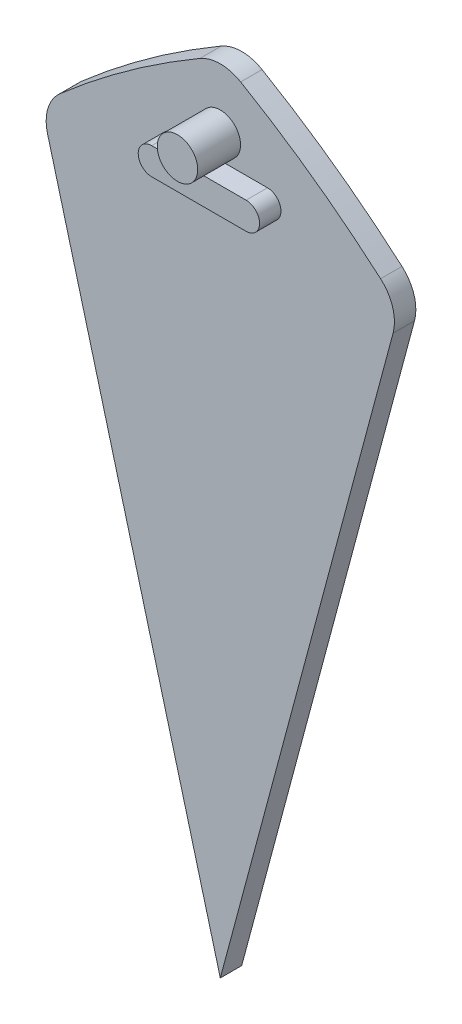
ISO-10303-21;
HEADER;
FILE_DESCRIPTION(('STEP AP214'),'2;1');
FILE_NAME('part.step','',(''),(''),'','','');
FILE_SCHEMA(('AUTOMOTIVE_DESIGN { 1 0 10303 214 1 1 1 1 }'));
ENDSEC;
DATA;
#1=APPLICATION_CONTEXT('core data for automotive mechanical design processes');
#2=APPLICATION_PROTOCOL_DEFINITION('international standard','automotive_design',2000,#1);
#3=PRODUCT_CONTEXT('',#1,'mechanical');
#4=PRODUCT('Part','Part','',(#3));
#5=PRODUCT_RELATED_PRODUCT_CATEGORY('part','',(#4));
#6=PRODUCT_DEFINITION_FORMATION('','',#4);
#7=PRODUCT_DEFINITION_CONTEXT('part definition',#1,'design');
#8=PRODUCT_DEFINITION('design','',#6,#7);
#9=PRODUCT_DEFINITION_SHAPE('','',#8);
#10=(LENGTH_UNIT() NAMED_UNIT(*) SI_UNIT(.MILLI.,.METRE.));
#11=(NAMED_UNIT(*) PLANE_ANGLE_UNIT() SI_UNIT($,.RADIAN.));
#12=(NAMED_UNIT(*) SI_UNIT($,.STERADIAN.) SOLID_ANGLE_UNIT());
#13=UNCERTAINTY_MEASURE_WITH_UNIT(LENGTH_MEASURE(1.E-05),#10,'distance_accuracy_value','');
#14=(GEOMETRIC_REPRESENTATION_CONTEXT(3) GLOBAL_UNCERTAINTY_ASSIGNED_CONTEXT((#13)) GLOBAL_UNIT_ASSIGNED_CONTEXT((#10,
#11,#12)) REPRESENTATION_CONTEXT('',''));
#15=CARTESIAN_POINT('',(0.,0.,0.));
#16=DIRECTION('',(0.,0.,1.));
#17=DIRECTION('',(1.,0.,0.));
#18=AXIS2_PLACEMENT_3D('',#15,#16,#17);
#19=CARTESIAN_POINT('',(0.,0.,3.175));
#20=DIRECTION('',(0.,0.,1.));
#21=DIRECTION('',(1.,0.,0.));
#22=AXIS2_PLACEMENT_3D('',#19,#20,#21);
#23=PLANE('',#22);
#24=CARTESIAN_POINT('',(0.,108.5,3.175));
#25=DIRECTION('',(0.,0.,1.));
#26=DIRECTION('',(1.,0.,0.));
#27=AXIS2_PLACEMENT_3D('',#24,#25,#26);
#28=CIRCLE('',#27,3.);
#29=CARTESIAN_POINT('',(3.,108.5,3.175));
#30=VERTEX_POINT('',#29);
#31=EDGE_CURVE('E276',#30,#30,#28,.T.);
#32=ORIENTED_EDGE('',*,*,#31,.F.);
#33=EDGE_LOOP('',(#32));
#34=FACE_BOUND('',#33,.T.);
#35=DIRECTION('',(0.258819045102521,0.965925826289068,0.));
#36=VECTOR('',#35,1.);
#37=CARTESIAN_POINT('',(0.,0.,3.175));
#38=LINE('',#37,#36);
#39=CARTESIAN_POINT('',(0.,0.,3.175));
#40=VERTEX_POINT('',#39);
#41=CARTESIAN_POINT('',(25.6246731471185,95.632582112392,3.175));
#42=VERTEX_POINT('',#41);
#43=EDGE_CURVE('E162',#40,#42,#38,.T.);
#44=ORIENTED_EDGE('',*,*,#43,.T.);
#45=CARTESIAN_POINT('',(19.8291181893841,97.1854963830071,3.175));
#46=DIRECTION('',(0.,0.,1.));
#47=DIRECTION('',(1.,0.,0.));
#48=AXIS2_PLACEMENT_3D('',#45,#46,#47);
#49=CIRCLE('',#48,6.);
#50=CARTESIAN_POINT('',(23.7746585702857,101.705752028728,3.175));
#51=VERTEX_POINT('',#50);
#52=EDGE_CURVE('E178',#42,#51,#49,.T.);
#53=ORIENTED_EDGE('',*,*,#52,.T.);
#54=CARTESIAN_POINT('',(-65.,0.,3.175));
#55=DIRECTION('',(0.,0.,1.));
#56=DIRECTION('',(1.,0.,0.));
#57=AXIS2_PLACEMENT_3D('',#54,#55,#56);
#58=CIRCLE('',#57,135.);
#59=CARTESIAN_POINT('',(3.02325581395349,116.609762320611,3.175));
#60=VERTEX_POINT('',#59);
#61=EDGE_CURVE('E146',#51,#60,#58,.T.);
#62=ORIENTED_EDGE('',*,*,#61,.T.);
#63=CARTESIAN_POINT('',(0.,111.427106217473,3.175));
#64=DIRECTION('',(0.,0.,1.));
#65=DIRECTION('',(1.,0.,0.));
#66=AXIS2_PLACEMENT_3D('',#63,#64,#65);
#67=CIRCLE('',#66,6.);
#68=CARTESIAN_POINT('',(-3.0232558139535,116.609762320611,3.175));
#69=VERTEX_POINT('',#68);
#70=EDGE_CURVE('E176',#60,#69,#67,.T.);
#71=ORIENTED_EDGE('',*,*,#70,.T.);
#72=CARTESIAN_POINT('',(65.,0.,3.175));
#73=DIRECTION('',(0.,0.,1.));
#74=DIRECTION('',(1.,0.,0.));
#75=AXIS2_PLACEMENT_3D('',#72,#73,#74);
#76=CIRCLE('',#75,135.);
#77=CARTESIAN_POINT('',(-23.7746585702858,101.705752028728,3.175));
#78=VERTEX_POINT('',#77);
#79=EDGE_CURVE('E143',#69,#78,#76,.T.);
#80=ORIENTED_EDGE('',*,*,#79,.T.);
#81=CARTESIAN_POINT('',(-19.8291181893842,97.1854963830071,3.175));
#82=DIRECTION('',(0.,0.,1.));
#83=DIRECTION('',(1.,0.,0.));
#84=AXIS2_PLACEMENT_3D('',#81,#82,#83);
#85=CIRCLE('',#84,6.);
#86=CARTESIAN_POINT('',(-25.6246731471186,95.632582112392,3.175));
#87=VERTEX_POINT('',#86);
#88=EDGE_CURVE('E174',#78,#87,#85,.T.);
#89=ORIENTED_EDGE('',*,*,#88,.T.);
#90=DIRECTION('',(-0.258819045102522,0.965925826289068,0.));
#91=VECTOR('',#90,1.);
#92=CARTESIAN_POINT('',(0.,0.,3.175));
#93=LINE('',#92,#91);
#94=EDGE_CURVE('E160',#40,#87,#93,.T.);
#95=ORIENTED_EDGE('',*,*,#94,.F.);
#96=EDGE_LOOP('',(#44,#53,#62,#71,#80,#89,#95));
#97=FACE_BOUND('',#96,.T.);
#98=DIRECTION('',(-1.,0.,0.));
#99=VECTOR('',#98,1.);
#100=CARTESIAN_POINT('',(7.,105.,3.175));
#101=LINE('',#100,#99);
#102=CARTESIAN_POINT('',(7.,105.,3.175));
#103=VERTEX_POINT('',#102);
#104=CARTESIAN_POINT('',(-7.,105.,3.175));
#105=VERTEX_POINT('',#104);
#106=EDGE_CURVE('E278',#103,#105,#101,.T.);
#107=ORIENTED_EDGE('',*,*,#106,.F.);
#108=CARTESIAN_POINT('',(7.,103.,3.175));
#109=DIRECTION('',(0.,0.,1.));
#110=DIRECTION('',(1.,0.,0.));
#111=AXIS2_PLACEMENT_3D('',#108,#109,#110);
#112=CIRCLE('',#111,2.);
#113=CARTESIAN_POINT('',(7.,101.,3.175));
#114=VERTEX_POINT('',#113);
#115=EDGE_CURVE('E141',#114,#103,#112,.T.);
#116=ORIENTED_EDGE('',*,*,#115,.F.);
#117=DIRECTION('',(1.,0.,0.));
#118=VECTOR('',#117,1.);
#119=CARTESIAN_POINT('',(7.,101.,3.175));
#120=LINE('',#119,#118);
#121=CARTESIAN_POINT('',(-7.,101.,3.175));
#122=VERTEX_POINT('',#121);
#123=EDGE_CURVE('E137',#122,#114,#120,.T.);
#124=ORIENTED_EDGE('',*,*,#123,.F.);
#125=CARTESIAN_POINT('',(-7.,103.,3.175));
#126=DIRECTION('',(0.,0.,1.));
#127=DIRECTION('',(1.,0.,0.));
#128=AXIS2_PLACEMENT_3D('',#125,#126,#127);
#129=CIRCLE('',#128,2.);
#130=EDGE_CURVE('E287',#105,#122,#129,.T.);
#131=ORIENTED_EDGE('',*,*,#130,.F.);
#132=EDGE_LOOP('',(#107,#116,#124,#131));
#133=FACE_BOUND('',#132,.T.);
#134=ADVANCED_FACE('F35',(#34,#97,#133),#23,.T.);
#135=CARTESIAN_POINT('',(0.,0.,3.175));
#136=DIRECTION('',(-0.965925826289068,-0.258819045102522,0.));
#137=DIRECTION('',(0.258819045102522,-0.965925826289068,0.));
#138=AXIS2_PLACEMENT_3D('',#135,#136,#137);
#139=PLANE('',#138);
#140=ORIENTED_EDGE('',*,*,#94,.T.);
#141=DIRECTION('',(0.,0.,1.));
#142=VECTOR('',#141,1.);
#143=CARTESIAN_POINT('',(-25.6246731471186,95.632582112392,3.175));
#144=LINE('',#143,#142);
#145=CARTESIAN_POINT('',(-25.6246731471186,95.632582112392,0.));
#146=VERTEX_POINT('',#145);
#147=EDGE_CURVE('E11',#87,#146,#144,.F.);
#148=ORIENTED_EDGE('',*,*,#147,.T.);
#149=DIRECTION('',(-0.258819045102522,0.965925826289068,0.));
#150=VECTOR('',#149,1.);
#151=CARTESIAN_POINT('',(0.,0.,0.));
#152=LINE('',#151,#150);
#153=CARTESIAN_POINT('',(0.,0.,0.));
#154=VERTEX_POINT('',#153);
#155=EDGE_CURVE('E156',#154,#146,#152,.T.);
#156=ORIENTED_EDGE('',*,*,#155,.F.);
#157=DIRECTION('',(0.,0.,-1.));
#158=VECTOR('',#157,1.);
#159=CARTESIAN_POINT('',(0.,0.,3.175));
#160=LINE('',#159,#158);
#161=EDGE_CURVE('E166',#40,#154,#160,.T.);
#162=ORIENTED_EDGE('',*,*,#161,.F.);
#163=EDGE_LOOP('',(#140,#148,#156,#162));
#164=FACE_BOUND('',#163,.T.);
#165=ADVANCED_FACE('F222',(#164),#139,.T.);
#166=CARTESIAN_POINT('',(0.,0.,3.175));
#167=DIRECTION('',(-0.965925826289068,0.258819045102521,0.));
#168=DIRECTION('',(-0.258819045102521,-0.965925826289068,0.));
#169=AXIS2_PLACEMENT_3D('',#166,#167,#168);
#170=PLANE('',#169);
#171=DIRECTION('',(0.258819045102521,0.965925826289068,0.));
#172=VECTOR('',#171,1.);
#173=CARTESIAN_POINT('',(0.,0.,0.));
#174=LINE('',#173,#172);
#175=CARTESIAN_POINT('',(25.6246731471185,95.632582112392,0.));
#176=VERTEX_POINT('',#175);
#177=EDGE_CURVE('E163',#154,#176,#174,.T.);
#178=ORIENTED_EDGE('',*,*,#177,.T.);
#179=DIRECTION('',(0.,0.,-1.));
#180=VECTOR('',#179,1.);
#181=CARTESIAN_POINT('',(25.6246731471185,95.632582112392,3.175));
#182=LINE('',#181,#180);
#183=EDGE_CURVE('E171',#176,#42,#182,.F.);
#184=ORIENTED_EDGE('',*,*,#183,.T.);
#185=ORIENTED_EDGE('',*,*,#43,.F.);
#186=ORIENTED_EDGE('',*,*,#161,.T.);
#187=EDGE_LOOP('',(#178,#184,#185,#186));
#188=FACE_BOUND('',#187,.T.);
#189=ADVANCED_FACE('F220',(#188),#170,.F.);
#190=CARTESIAN_POINT('',(0.,0.,0.));
#191=DIRECTION('',(0.,0.,1.));
#192=DIRECTION('',(1.,0.,0.));
#193=AXIS2_PLACEMENT_3D('',#190,#191,#192);
#194=PLANE('',#193);
#195=CARTESIAN_POINT('',(-65.,0.,0.));
#196=DIRECTION('',(0.,0.,1.));
#197=DIRECTION('',(1.,0.,0.));
#198=AXIS2_PLACEMENT_3D('',#195,#196,#197);
#199=CIRCLE('',#198,135.);
#200=CARTESIAN_POINT('',(23.7746585702857,101.705752028728,0.));
#201=VERTEX_POINT('',#200);
#202=CARTESIAN_POINT('',(3.02325581395349,116.609762320611,0.));
#203=VERTEX_POINT('',#202);
#204=EDGE_CURVE('E154',#201,#203,#199,.T.);
#205=ORIENTED_EDGE('',*,*,#204,.F.);
#206=CARTESIAN_POINT('',(19.8291181893841,97.1854963830071,0.));
#207=DIRECTION('',(0.,0.,1.));
#208=DIRECTION('',(1.,0.,0.));
#209=AXIS2_PLACEMENT_3D('',#206,#207,#208);
#210=CIRCLE('',#209,6.);
#211=EDGE_CURVE('E189',#201,#176,#210,.F.);
#212=ORIENTED_EDGE('',*,*,#211,.T.);
#213=ORIENTED_EDGE('',*,*,#177,.F.);
#214=ORIENTED_EDGE('',*,*,#155,.T.);
#215=CARTESIAN_POINT('',(-19.8291181893842,97.1854963830071,0.));
#216=DIRECTION('',(0.,0.,1.));
#217=DIRECTION('',(1.,0.,0.));
#218=AXIS2_PLACEMENT_3D('',#215,#216,#217);
#219=CIRCLE('',#218,6.);
#220=CARTESIAN_POINT('',(-23.7746585702858,101.705752028728,0.));
#221=VERTEX_POINT('',#220);
#222=EDGE_CURVE('E185',#146,#221,#219,.F.);
#223=ORIENTED_EDGE('',*,*,#222,.T.);
#224=CARTESIAN_POINT('',(65.,0.,0.));
#225=DIRECTION('',(0.,0.,1.));
#226=DIRECTION('',(1.,0.,0.));
#227=AXIS2_PLACEMENT_3D('',#224,#225,#226);
#228=CIRCLE('',#227,135.);
#229=CARTESIAN_POINT('',(-3.0232558139535,116.609762320611,0.));
#230=VERTEX_POINT('',#229);
#231=EDGE_CURVE('E151',#230,#221,#228,.T.);
#232=ORIENTED_EDGE('',*,*,#231,.F.);
#233=CARTESIAN_POINT('',(0.,111.427106217473,0.));
#234=DIRECTION('',(0.,0.,1.));
#235=DIRECTION('',(1.,0.,0.));
#236=AXIS2_PLACEMENT_3D('',#233,#234,#235);
#237=CIRCLE('',#236,6.);
#238=EDGE_CURVE('E187',#230,#203,#237,.F.);
#239=ORIENTED_EDGE('',*,*,#238,.T.);
#240=EDGE_LOOP('',(#205,#212,#213,#214,#223,#232,#239));
#241=FACE_BOUND('',#240,.T.);
#242=ADVANCED_FACE('F203',(#241),#194,.F.);
#243=CARTESIAN_POINT('',(65.,0.,0.));
#244=DIRECTION('',(0.,0.,1.));
#245=DIRECTION('',(1.,0.,0.));
#246=AXIS2_PLACEMENT_3D('',#243,#244,#245);
#247=CYLINDRICAL_SURFACE('',#246,135.);
#248=ORIENTED_EDGE('',*,*,#79,.F.);
#249=DIRECTION('',(0.,0.,1.));
#250=VECTOR('',#249,1.);
#251=CARTESIAN_POINT('',(-3.0232558139535,116.609762320611,0.));
#252=LINE('',#251,#250);
#253=EDGE_CURVE('E43',#69,#230,#252,.F.);
#254=ORIENTED_EDGE('',*,*,#253,.T.);
#255=ORIENTED_EDGE('',*,*,#231,.T.);
#256=DIRECTION('',(0.,0.,1.));
#257=VECTOR('',#256,1.);
#258=CARTESIAN_POINT('',(-23.7746585702858,101.705752028728,0.));
#259=LINE('',#258,#257);
#260=EDGE_CURVE('E191',#221,#78,#259,.T.);
#261=ORIENTED_EDGE('',*,*,#260,.T.);
#262=EDGE_LOOP('',(#248,#254,#255,#261));
#263=FACE_BOUND('',#262,.T.);
#264=ADVANCED_FACE('F197',(#263),#247,.T.);
#265=CARTESIAN_POINT('',(-65.,0.,0.));
#266=DIRECTION('',(0.,0.,1.));
#267=DIRECTION('',(1.,0.,0.));
#268=AXIS2_PLACEMENT_3D('',#265,#266,#267);
#269=CYLINDRICAL_SURFACE('',#268,135.);
#270=ORIENTED_EDGE('',*,*,#61,.F.);
#271=DIRECTION('',(0.,0.,1.));
#272=VECTOR('',#271,1.);
#273=CARTESIAN_POINT('',(23.7746585702857,101.705752028728,0.));
#274=LINE('',#273,#272);
#275=EDGE_CURVE('E183',#51,#201,#274,.F.);
#276=ORIENTED_EDGE('',*,*,#275,.T.);
#277=ORIENTED_EDGE('',*,*,#204,.T.);
#278=DIRECTION('',(0.,0.,1.));
#279=VECTOR('',#278,1.);
#280=CARTESIAN_POINT('',(3.02325581395349,116.609762320611,0.));
#281=LINE('',#280,#279);
#282=EDGE_CURVE('E180',#203,#60,#281,.T.);
#283=ORIENTED_EDGE('',*,*,#282,.T.);
#284=EDGE_LOOP('',(#270,#276,#277,#283));
#285=FACE_BOUND('',#284,.T.);
#286=ADVANCED_FACE('F209',(#285),#269,.T.);
#287=CARTESIAN_POINT('',(19.8291181893841,97.1854963830071,0.));
#288=DIRECTION('',(0.,0.,1.));
#289=DIRECTION('',(1.,0.,0.));
#290=AXIS2_PLACEMENT_3D('',#287,#288,#289);
#291=CYLINDRICAL_SURFACE('',#290,6.);
#292=ORIENTED_EDGE('',*,*,#211,.F.);
#293=ORIENTED_EDGE('',*,*,#275,.F.);
#294=ORIENTED_EDGE('',*,*,#52,.F.);
#295=ORIENTED_EDGE('',*,*,#183,.F.);
#296=EDGE_LOOP('',(#292,#293,#294,#295));
#297=FACE_BOUND('',#296,.T.);
#298=ADVANCED_FACE('F218',(#297),#291,.T.);
#299=CARTESIAN_POINT('',(0.,111.427106217473,0.));
#300=DIRECTION('',(0.,0.,1.));
#301=DIRECTION('',(1.,0.,0.));
#302=AXIS2_PLACEMENT_3D('',#299,#300,#301);
#303=CYLINDRICAL_SURFACE('',#302,6.);
#304=ORIENTED_EDGE('',*,*,#238,.F.);
#305=ORIENTED_EDGE('',*,*,#253,.F.);
#306=ORIENTED_EDGE('',*,*,#70,.F.);
#307=ORIENTED_EDGE('',*,*,#282,.F.);
#308=EDGE_LOOP('',(#304,#305,#306,#307));
#309=FACE_BOUND('',#308,.T.);
#310=ADVANCED_FACE('F206',(#309),#303,.T.);
#311=CARTESIAN_POINT('',(-19.8291181893842,97.1854963830071,0.));
#312=DIRECTION('',(0.,0.,1.));
#313=DIRECTION('',(1.,0.,0.));
#314=AXIS2_PLACEMENT_3D('',#311,#312,#313);
#315=CYLINDRICAL_SURFACE('',#314,6.);
#316=ORIENTED_EDGE('',*,*,#222,.F.);
#317=ORIENTED_EDGE('',*,*,#147,.F.);
#318=ORIENTED_EDGE('',*,*,#88,.F.);
#319=ORIENTED_EDGE('',*,*,#260,.F.);
#320=EDGE_LOOP('',(#316,#317,#318,#319));
#321=FACE_BOUND('',#320,.T.);
#322=ADVANCED_FACE('F37',(#321),#315,.T.);
#323=CARTESIAN_POINT('',(7.,103.,6.35));
#324=DIRECTION('',(0.,0.,-1.));
#325=DIRECTION('',(-1.,0.,0.));
#326=AXIS2_PLACEMENT_3D('',#323,#324,#325);
#327=CYLINDRICAL_SURFACE('',#326,2.);
#328=ORIENTED_EDGE('',*,*,#115,.T.);
#329=DIRECTION('',(0.,0.,-1.));
#330=VECTOR('',#329,1.);
#331=CARTESIAN_POINT('',(7.,105.,6.35));
#332=LINE('',#331,#330);
#333=CARTESIAN_POINT('',(7.,105.,6.35));
#334=VERTEX_POINT('',#333);
#335=EDGE_CURVE('E122',#334,#103,#332,.T.);
#336=ORIENTED_EDGE('',*,*,#335,.F.);
#337=CARTESIAN_POINT('',(7.,103.,6.35));
#338=DIRECTION('',(0.,0.,1.));
#339=DIRECTION('',(1.,0.,0.));
#340=AXIS2_PLACEMENT_3D('',#337,#338,#339);
#341=CIRCLE('',#340,2.);
#342=CARTESIAN_POINT('',(7.,101.,6.35));
#343=VERTEX_POINT('',#342);
#344=EDGE_CURVE('E129',#343,#334,#341,.T.);
#345=ORIENTED_EDGE('',*,*,#344,.F.);
#346=DIRECTION('',(0.,0.,-1.));
#347=VECTOR('',#346,1.);
#348=CARTESIAN_POINT('',(7.,101.,6.35));
#349=LINE('',#348,#347);
#350=EDGE_CURVE('E284',#343,#114,#349,.T.);
#351=ORIENTED_EDGE('',*,*,#350,.T.);
#352=EDGE_LOOP('',(#328,#336,#345,#351));
#353=FACE_BOUND('',#352,.T.);
#354=ADVANCED_FACE('F139',(#353),#327,.T.);
#355=CARTESIAN_POINT('',(7.,105.,6.35));
#356=DIRECTION('',(0.,-1.,0.));
#357=DIRECTION('',(0.,0.,-1.));
#358=AXIS2_PLACEMENT_3D('',#355,#356,#357);
#359=PLANE('',#358);
#360=ORIENTED_EDGE('',*,*,#106,.T.);
#361=DIRECTION('',(0.,0.,-1.));
#362=VECTOR('',#361,1.);
#363=CARTESIAN_POINT('',(-7.,105.,6.35));
#364=LINE('',#363,#362);
#365=CARTESIAN_POINT('',(-7.,105.,6.35));
#366=VERTEX_POINT('',#365);
#367=EDGE_CURVE('E125',#366,#105,#364,.T.);
#368=ORIENTED_EDGE('',*,*,#367,.F.);
#369=DIRECTION('',(-1.,0.,0.));
#370=VECTOR('',#369,1.);
#371=CARTESIAN_POINT('',(7.,105.,6.35));
#372=LINE('',#371,#370);
#373=EDGE_CURVE('E118',#334,#366,#372,.T.);
#374=ORIENTED_EDGE('',*,*,#373,.F.);
#375=ORIENTED_EDGE('',*,*,#335,.T.);
#376=EDGE_LOOP('',(#360,#368,#374,#375));
#377=FACE_BOUND('',#376,.T.);
#378=ADVANCED_FACE('F120',(#377),#359,.F.);
#379=CARTESIAN_POINT('',(-7.,103.,6.35));
#380=DIRECTION('',(0.,0.,-1.));
#381=DIRECTION('',(-1.,0.,0.));
#382=AXIS2_PLACEMENT_3D('',#379,#380,#381);
#383=CYLINDRICAL_SURFACE('',#382,2.);
#384=ORIENTED_EDGE('',*,*,#130,.T.);
#385=DIRECTION('',(0.,0.,-1.));
#386=VECTOR('',#385,1.);
#387=CARTESIAN_POINT('',(-7.,101.,6.35));
#388=LINE('',#387,#386);
#389=CARTESIAN_POINT('',(-7.,101.,6.35));
#390=VERTEX_POINT('',#389);
#391=EDGE_CURVE('E50',#390,#122,#388,.T.);
#392=ORIENTED_EDGE('',*,*,#391,.F.);
#393=CARTESIAN_POINT('',(-7.,103.,6.35));
#394=DIRECTION('',(0.,0.,1.));
#395=DIRECTION('',(1.,0.,0.));
#396=AXIS2_PLACEMENT_3D('',#393,#394,#395);
#397=CIRCLE('',#396,2.);
#398=EDGE_CURVE('E128',#366,#390,#397,.T.);
#399=ORIENTED_EDGE('',*,*,#398,.F.);
#400=ORIENTED_EDGE('',*,*,#367,.T.);
#401=EDGE_LOOP('',(#384,#392,#399,#400));
#402=FACE_BOUND('',#401,.T.);
#403=ADVANCED_FACE('F255',(#402),#383,.T.);
#404=CARTESIAN_POINT('',(7.,101.,6.35));
#405=DIRECTION('',(0.,1.,0.));
#406=DIRECTION('',(0.,0.,1.));
#407=AXIS2_PLACEMENT_3D('',#404,#405,#406);
#408=PLANE('',#407);
#409=ORIENTED_EDGE('',*,*,#123,.T.);
#410=ORIENTED_EDGE('',*,*,#350,.F.);
#411=DIRECTION('',(1.,0.,0.));
#412=VECTOR('',#411,1.);
#413=CARTESIAN_POINT('',(7.,101.,6.35));
#414=LINE('',#413,#412);
#415=EDGE_CURVE('E133',#390,#343,#414,.T.);
#416=ORIENTED_EDGE('',*,*,#415,.F.);
#417=ORIENTED_EDGE('',*,*,#391,.T.);
#418=EDGE_LOOP('',(#409,#410,#416,#417));
#419=FACE_BOUND('',#418,.T.);
#420=ADVANCED_FACE('F258',(#419),#408,.F.);
#421=CARTESIAN_POINT('',(7.,103.,6.35));
#422=DIRECTION('',(0.,0.,1.));
#423=DIRECTION('',(1.,0.,0.));
#424=AXIS2_PLACEMENT_3D('',#421,#422,#423);
#425=PLANE('',#424);
#426=ORIENTED_EDGE('',*,*,#344,.T.);
#427=ORIENTED_EDGE('',*,*,#373,.T.);
#428=ORIENTED_EDGE('',*,*,#398,.T.);
#429=ORIENTED_EDGE('',*,*,#415,.T.);
#430=EDGE_LOOP('',(#426,#427,#428,#429));
#431=FACE_BOUND('',#430,.T.);
#432=ADVANCED_FACE('F132',(#431),#425,.T.);
#433=CARTESIAN_POINT('',(0.,108.5,9.525));
#434=DIRECTION('',(0.,0.,-1.));
#435=DIRECTION('',(-1.,0.,0.));
#436=AXIS2_PLACEMENT_3D('',#433,#434,#435);
#437=CYLINDRICAL_SURFACE('',#436,3.);
#438=CARTESIAN_POINT('',(0.,108.5,9.525));
#439=DIRECTION('',(0.,0.,1.));
#440=DIRECTION('',(1.,0.,0.));
#441=AXIS2_PLACEMENT_3D('',#438,#439,#440);
#442=CIRCLE('',#441,3.);
#443=CARTESIAN_POINT('',(3.,108.5,9.525));
#444=VERTEX_POINT('',#443);
#445=EDGE_CURVE('E275',#444,#444,#442,.T.);
#446=ORIENTED_EDGE('',*,*,#445,.F.);
#447=EDGE_LOOP('',(#446));
#448=FACE_BOUND('',#447,.T.);
#449=ORIENTED_EDGE('',*,*,#31,.T.);
#450=EDGE_LOOP('',(#449));
#451=FACE_BOUND('',#450,.T.);
#452=ADVANCED_FACE('F264',(#448,#451),#437,.T.);
#453=CARTESIAN_POINT('',(0.,108.5,9.525));
#454=DIRECTION('',(0.,0.,1.));
#455=DIRECTION('',(1.,0.,0.));
#456=AXIS2_PLACEMENT_3D('',#453,#454,#455);
#457=PLANE('',#456);
#458=ORIENTED_EDGE('',*,*,#445,.T.);
#459=EDGE_LOOP('',(#458));
#460=FACE_BOUND('',#459,.T.);
#461=ADVANCED_FACE('F267',(#460),#457,.T.);
#462=CLOSED_SHELL('',(#134,#165,#189,#242,#264,#286,#298,#310,#322,#354,#378,#403,#420,#432,
#452,#461));
#463=MANIFOLD_SOLID_BREP('B2',#462);
#464=ADVANCED_BREP_SHAPE_REPRESENTATION('',(#18,#463),#14);
#465=SHAPE_DEFINITION_REPRESENTATION(#9,#464);
ENDSEC;
END-ISO-10303-21;
